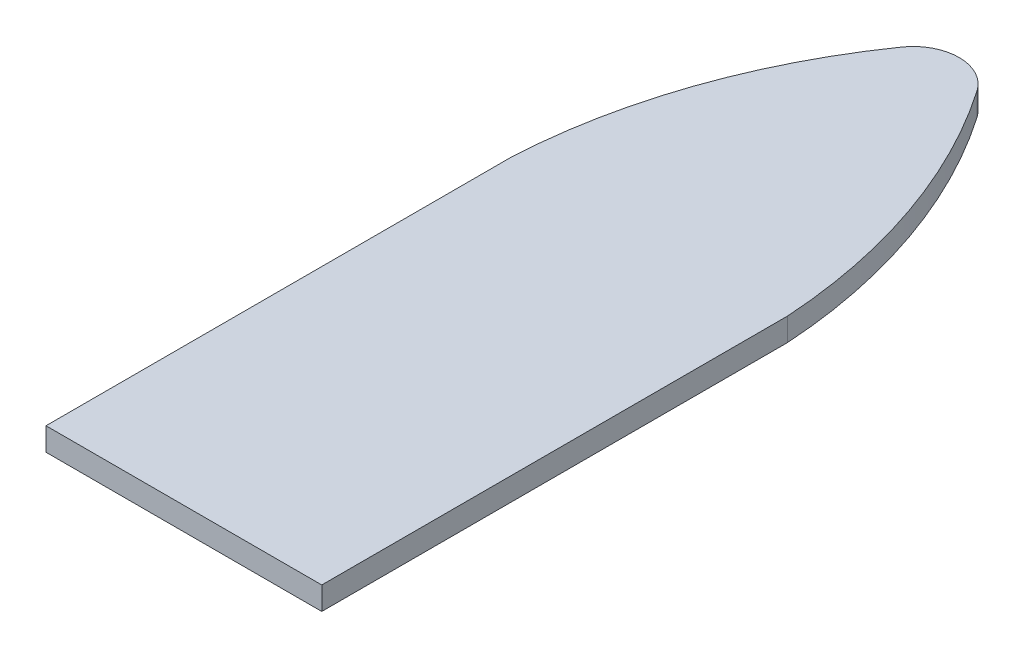
ISO-10303-21;
HEADER;
FILE_DESCRIPTION(('STEP AP214'),'2;1');
FILE_NAME('part.step','',(''),(''),'','','');
FILE_SCHEMA(('AUTOMOTIVE_DESIGN { 1 0 10303 214 1 1 1 1 }'));
ENDSEC;
DATA;
#1=APPLICATION_CONTEXT('core data for automotive mechanical design processes');
#2=APPLICATION_PROTOCOL_DEFINITION('international standard','automotive_design',2000,#1);
#3=PRODUCT_CONTEXT('',#1,'mechanical');
#4=PRODUCT('Part','Part','',(#3));
#5=PRODUCT_RELATED_PRODUCT_CATEGORY('part','',(#4));
#6=PRODUCT_DEFINITION_FORMATION('','',#4);
#7=PRODUCT_DEFINITION_CONTEXT('part definition',#1,'design');
#8=PRODUCT_DEFINITION('design','',#6,#7);
#9=PRODUCT_DEFINITION_SHAPE('','',#8);
#10=(LENGTH_UNIT() NAMED_UNIT(*) SI_UNIT(.MILLI.,.METRE.));
#11=(NAMED_UNIT(*) PLANE_ANGLE_UNIT() SI_UNIT($,.RADIAN.));
#12=(NAMED_UNIT(*) SI_UNIT($,.STERADIAN.) SOLID_ANGLE_UNIT());
#13=UNCERTAINTY_MEASURE_WITH_UNIT(LENGTH_MEASURE(1.E-05),#10,'distance_accuracy_value','');
#14=(GEOMETRIC_REPRESENTATION_CONTEXT(3) GLOBAL_UNCERTAINTY_ASSIGNED_CONTEXT((#13)) GLOBAL_UNIT_ASSIGNED_CONTEXT((#10,
#11,#12)) REPRESENTATION_CONTEXT('',''));
#15=CARTESIAN_POINT('',(0.,0.,0.));
#16=DIRECTION('',(0.,0.,1.));
#17=DIRECTION('',(1.,0.,0.));
#18=AXIS2_PLACEMENT_3D('',#15,#16,#17);
#19=CARTESIAN_POINT('',(-60.,0.,101.35));
#20=DIRECTION('',(-1.,0.,0.));
#21=DIRECTION('',(0.,0.,1.));
#22=AXIS2_PLACEMENT_3D('',#19,#20,#21);
#23=PLANE('',#22);
#24=DIRECTION('',(0.,1.,0.));
#25=VECTOR('',#24,1.);
#26=CARTESIAN_POINT('',(-60.,0.,-101.35));
#27=LINE('',#26,#25);
#28=CARTESIAN_POINT('',(-60.,0.,-101.35));
#29=VERTEX_POINT('',#28);
#30=CARTESIAN_POINT('',(-60.,10.,-101.35));
#31=VERTEX_POINT('',#30);
#32=EDGE_CURVE('E11',#29,#31,#27,.T.);
#33=ORIENTED_EDGE('',*,*,#32,.F.);
#34=DIRECTION('',(0.,0.,1.));
#35=VECTOR('',#34,1.);
#36=CARTESIAN_POINT('',(-60.,0.,101.35));
#37=LINE('',#36,#35);
#38=CARTESIAN_POINT('',(-60.,0.,101.35));
#39=VERTEX_POINT('',#38);
#40=EDGE_CURVE('E141',#29,#39,#37,.T.);
#41=ORIENTED_EDGE('',*,*,#40,.T.);
#42=DIRECTION('',(0.,1.,0.));
#43=VECTOR('',#42,1.);
#44=CARTESIAN_POINT('',(-60.,0.,101.35));
#45=LINE('',#44,#43);
#46=CARTESIAN_POINT('',(-60.,10.,101.35));
#47=VERTEX_POINT('',#46);
#48=EDGE_CURVE('E58',#39,#47,#45,.T.);
#49=ORIENTED_EDGE('',*,*,#48,.T.);
#50=DIRECTION('',(0.,0.,1.));
#51=VECTOR('',#50,1.);
#52=CARTESIAN_POINT('',(-60.,10.,-216.114072102744));
#53=LINE('',#52,#51);
#54=EDGE_CURVE('E140',#31,#47,#53,.T.);
#55=ORIENTED_EDGE('',*,*,#54,.F.);
#56=EDGE_LOOP('',(#33,#41,#49,#55));
#57=FACE_BOUND('',#56,.T.);
#58=ADVANCED_FACE('F47',(#57),#23,.T.);
#59=CARTESIAN_POINT('',(60.,0.,101.35));
#60=DIRECTION('',(0.,0.,1.));
#61=DIRECTION('',(1.,0.,0.));
#62=AXIS2_PLACEMENT_3D('',#59,#60,#61);
#63=PLANE('',#62);
#64=ORIENTED_EDGE('',*,*,#48,.F.);
#65=DIRECTION('',(1.,0.,0.));
#66=VECTOR('',#65,1.);
#67=CARTESIAN_POINT('',(60.,0.,101.35));
#68=LINE('',#67,#66);
#69=CARTESIAN_POINT('',(60.,0.,101.35));
#70=VERTEX_POINT('',#69);
#71=EDGE_CURVE('E126',#39,#70,#68,.T.);
#72=ORIENTED_EDGE('',*,*,#71,.T.);
#73=DIRECTION('',(0.,1.,0.));
#74=VECTOR('',#73,1.);
#75=CARTESIAN_POINT('',(60.,0.,101.35));
#76=LINE('',#75,#74);
#77=CARTESIAN_POINT('',(60.,10.,101.35));
#78=VERTEX_POINT('',#77);
#79=EDGE_CURVE('E132',#70,#78,#76,.T.);
#80=ORIENTED_EDGE('',*,*,#79,.T.);
#81=DIRECTION('',(1.,0.,0.));
#82=VECTOR('',#81,1.);
#83=CARTESIAN_POINT('',(-0.126527975512775,10.,101.35));
#84=LINE('',#83,#82);
#85=EDGE_CURVE('E151',#47,#78,#84,.T.);
#86=ORIENTED_EDGE('',*,*,#85,.F.);
#87=EDGE_LOOP('',(#64,#72,#80,#86));
#88=FACE_BOUND('',#87,.T.);
#89=ADVANCED_FACE('F156',(#88),#63,.T.);
#90=CARTESIAN_POINT('',(60.,0.,101.35));
#91=DIRECTION('',(1.,0.,0.));
#92=DIRECTION('',(0.,0.,-1.));
#93=AXIS2_PLACEMENT_3D('',#90,#91,#92);
#94=PLANE('',#93);
#95=ORIENTED_EDGE('',*,*,#79,.F.);
#96=DIRECTION('',(0.,0.,-1.));
#97=VECTOR('',#96,1.);
#98=CARTESIAN_POINT('',(60.,0.,101.35));
#99=LINE('',#98,#97);
#100=CARTESIAN_POINT('',(59.9999999999999,0.,-101.35));
#101=VERTEX_POINT('',#100);
#102=EDGE_CURVE('E120',#70,#101,#99,.T.);
#103=ORIENTED_EDGE('',*,*,#102,.T.);
#104=DIRECTION('',(0.,1.,0.));
#105=VECTOR('',#104,1.);
#106=CARTESIAN_POINT('',(59.9999999999999,0.,-101.35));
#107=LINE('',#106,#105);
#108=CARTESIAN_POINT('',(60.,10.,-101.349999999999));
#109=VERTEX_POINT('',#108);
#110=EDGE_CURVE('E95',#101,#109,#107,.T.);
#111=ORIENTED_EDGE('',*,*,#110,.T.);
#112=DIRECTION('',(0.,0.,1.));
#113=VECTOR('',#112,1.);
#114=CARTESIAN_POINT('',(60.,10.,-216.114072102744));
#115=LINE('',#114,#113);
#116=EDGE_CURVE('E158',#78,#109,#115,.F.);
#117=ORIENTED_EDGE('',*,*,#116,.F.);
#118=EDGE_LOOP('',(#95,#103,#111,#117));
#119=FACE_BOUND('',#118,.T.);
#120=ADVANCED_FACE('F172',(#119),#94,.T.);
#121=CARTESIAN_POINT('',(-189.502720177052,0.,-85.5895233494699));
#122=DIRECTION('',(0.,1.,0.));
#123=DIRECTION('',(0.,0.,1.));
#124=AXIS2_PLACEMENT_3D('',#121,#122,#123);
#125=CYLINDRICAL_SURFACE('',#124,250.);
#126=ORIENTED_EDGE('',*,*,#110,.F.);
#127=CARTESIAN_POINT('',(-189.502720177052,0.,-85.5895233494699));
#128=DIRECTION('',(0.,1.,0.));
#129=DIRECTION('',(0.,0.,-1.));
#130=AXIS2_PLACEMENT_3D('',#127,#128,#129);
#131=CIRCLE('',#130,250.);
#132=CARTESIAN_POINT('',(16.340966998534,0.,-227.464032863898));
#133=VERTEX_POINT('',#132);
#134=EDGE_CURVE('E112',#101,#133,#131,.T.);
#135=ORIENTED_EDGE('',*,*,#134,.T.);
#136=DIRECTION('',(0.,1.,0.));
#137=VECTOR('',#136,1.);
#138=CARTESIAN_POINT('',(16.340966998534,0.,-227.464032863898));
#139=LINE('',#138,#137);
#140=CARTESIAN_POINT('',(16.340966998534,10.,-227.464032863898));
#141=VERTEX_POINT('',#140);
#142=EDGE_CURVE('E66',#133,#141,#139,.T.);
#143=ORIENTED_EDGE('',*,*,#142,.T.);
#144=CARTESIAN_POINT('',(-189.502720177052,10.,-85.5895233494699));
#145=DIRECTION('',(0.,1.,0.));
#146=DIRECTION('',(0.,0.,1.));
#147=AXIS2_PLACEMENT_3D('',#144,#145,#146);
#148=CIRCLE('',#147,250.);
#149=EDGE_CURVE('E161',#109,#141,#148,.T.);
#150=ORIENTED_EDGE('',*,*,#149,.F.);
#151=EDGE_LOOP('',(#126,#135,#143,#150));
#152=FACE_BOUND('',#151,.T.);
#153=ADVANCED_FACE('F118',(#152),#125,.T.);
#154=CARTESIAN_POINT('',(-0.126527975512775,0.,-216.114072102744));
#155=DIRECTION('',(0.,1.,0.));
#156=DIRECTION('',(0.,0.,1.));
#157=AXIS2_PLACEMENT_3D('',#154,#155,#156);
#158=CYLINDRICAL_SURFACE('',#157,20.);
#159=ORIENTED_EDGE('',*,*,#142,.F.);
#160=CARTESIAN_POINT('',(-0.126527975512775,0.,-216.114072102744));
#161=DIRECTION('',(0.,1.,0.));
#162=DIRECTION('',(0.,0.,1.));
#163=AXIS2_PLACEMENT_3D('',#160,#161,#162);
#164=CIRCLE('',#163,20.);
#165=CARTESIAN_POINT('',(-16.5236726089726,0.,-227.565432190934));
#166=VERTEX_POINT('',#165);
#167=EDGE_CURVE('E101',#133,#166,#164,.T.);
#168=ORIENTED_EDGE('',*,*,#167,.T.);
#169=DIRECTION('',(0.,1.,0.));
#170=VECTOR('',#169,1.);
#171=CARTESIAN_POINT('',(-16.5236726089726,0.,-227.565432190934));
#172=LINE('',#171,#170);
#173=CARTESIAN_POINT('',(-16.5236726089726,10.,-227.565432190934));
#174=VERTEX_POINT('',#173);
#175=EDGE_CURVE('E51',#166,#174,#172,.T.);
#176=ORIENTED_EDGE('',*,*,#175,.T.);
#177=CARTESIAN_POINT('',(-0.126527975512775,10.,-216.114072102744));
#178=DIRECTION('',(0.,1.,0.));
#179=DIRECTION('',(0.,0.,1.));
#180=AXIS2_PLACEMENT_3D('',#177,#178,#179);
#181=CIRCLE('',#180,20.);
#182=EDGE_CURVE('E103',#141,#174,#181,.T.);
#183=ORIENTED_EDGE('',*,*,#182,.F.);
#184=EDGE_LOOP('',(#159,#168,#176,#183));
#185=FACE_BOUND('',#184,.T.);
#186=ADVANCED_FACE('F100',(#185),#158,.T.);
#187=CARTESIAN_POINT('',(182.947591857067,0.,-88.2596367180991));
#188=DIRECTION('',(0.,1.,0.));
#189=DIRECTION('',(0.,0.,1.));
#190=AXIS2_PLACEMENT_3D('',#187,#188,#189);
#191=CYLINDRICAL_SURFACE('',#190,243.3);
#192=CARTESIAN_POINT('',(182.947591857067,0.,-88.2596367180991));
#193=DIRECTION('',(0.,1.,0.));
#194=DIRECTION('',(0.,0.,-1.));
#195=AXIS2_PLACEMENT_3D('',#192,#193,#194);
#196=CIRCLE('',#195,243.3);
#197=EDGE_CURVE('E115',#166,#29,#196,.T.);
#198=ORIENTED_EDGE('',*,*,#197,.T.);
#199=ORIENTED_EDGE('',*,*,#32,.T.);
#200=CARTESIAN_POINT('',(182.947591857067,10.,-88.2596367180991));
#201=DIRECTION('',(0.,1.,0.));
#202=DIRECTION('',(0.,0.,1.));
#203=AXIS2_PLACEMENT_3D('',#200,#201,#202);
#204=CIRCLE('',#203,243.3);
#205=EDGE_CURVE('E124',#174,#31,#204,.T.);
#206=ORIENTED_EDGE('',*,*,#205,.F.);
#207=ORIENTED_EDGE('',*,*,#175,.F.);
#208=EDGE_LOOP('',(#198,#199,#206,#207));
#209=FACE_BOUND('',#208,.T.);
#210=ADVANCED_FACE('F49',(#209),#191,.T.);
#211=CARTESIAN_POINT('',(-0.126527975512775,10.,-216.114072102744));
#212=DIRECTION('',(0.,1.,0.));
#213=DIRECTION('',(0.,0.,1.));
#214=AXIS2_PLACEMENT_3D('',#211,#212,#213);
#215=PLANE('',#214);
#216=ORIENTED_EDGE('',*,*,#182,.T.);
#217=ORIENTED_EDGE('',*,*,#205,.T.);
#218=ORIENTED_EDGE('',*,*,#54,.T.);
#219=ORIENTED_EDGE('',*,*,#85,.T.);
#220=ORIENTED_EDGE('',*,*,#116,.T.);
#221=ORIENTED_EDGE('',*,*,#149,.T.);
#222=EDGE_LOOP('',(#216,#217,#218,#219,#220,#221));
#223=FACE_BOUND('',#222,.T.);
#224=ADVANCED_FACE('F149',(#223),#215,.T.);
#225=CARTESIAN_POINT('',(-0.126527975512775,0.,-216.114072102744));
#226=DIRECTION('',(0.,1.,0.));
#227=DIRECTION('',(0.,0.,1.));
#228=AXIS2_PLACEMENT_3D('',#225,#226,#227);
#229=PLANE('',#228);
#230=ORIENTED_EDGE('',*,*,#167,.F.);
#231=ORIENTED_EDGE('',*,*,#134,.F.);
#232=ORIENTED_EDGE('',*,*,#102,.F.);
#233=ORIENTED_EDGE('',*,*,#71,.F.);
#234=ORIENTED_EDGE('',*,*,#40,.F.);
#235=ORIENTED_EDGE('',*,*,#197,.F.);
#236=EDGE_LOOP('',(#230,#231,#232,#233,#234,#235));
#237=FACE_BOUND('',#236,.T.);
#238=ADVANCED_FACE('F110',(#237),#229,.F.);
#239=CLOSED_SHELL('',(#58,#89,#120,#153,#186,#210,#224,#238));
#240=MANIFOLD_SOLID_BREP('B2',#239);
#241=ADVANCED_BREP_SHAPE_REPRESENTATION('',(#18,#240),#14);
#242=SHAPE_DEFINITION_REPRESENTATION(#9,#241);
ENDSEC;
END-ISO-10303-21;
